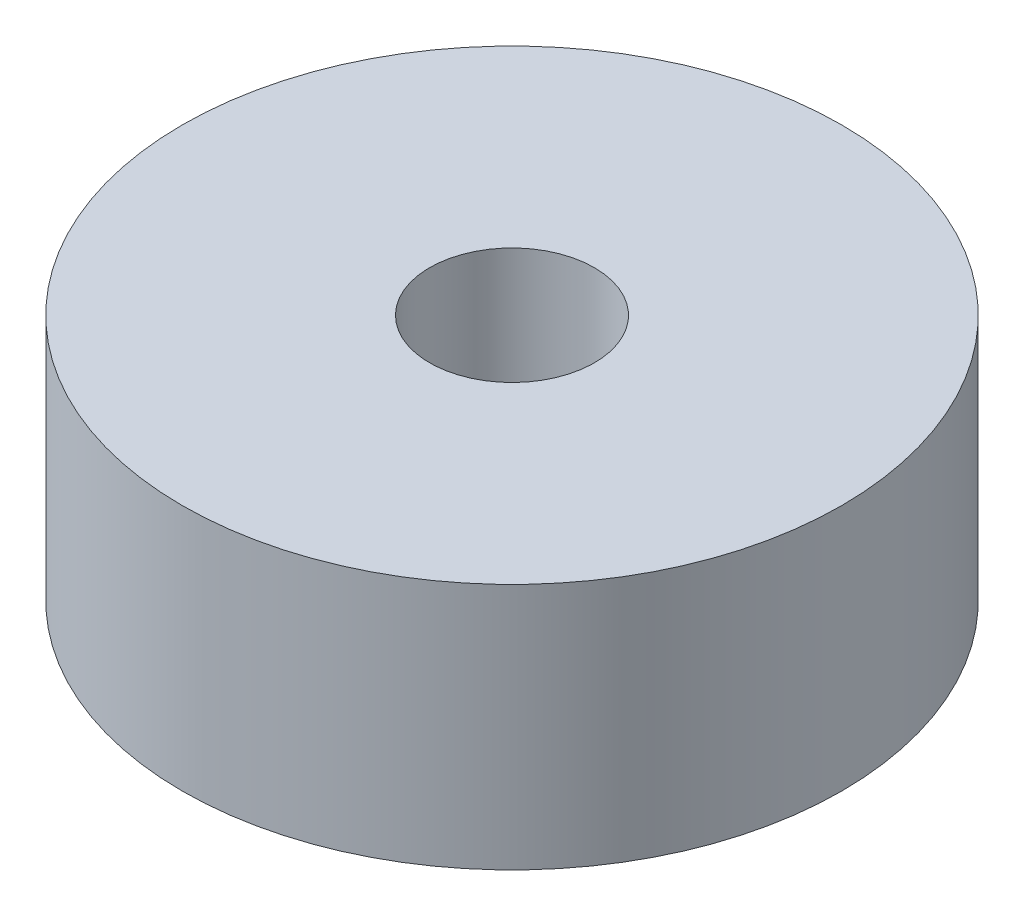
ISO-10303-21;
HEADER;
FILE_DESCRIPTION(('STEP AP214'),'2;1');
FILE_NAME('part.step','',(''),(''),'','','');
FILE_SCHEMA(('AUTOMOTIVE_DESIGN { 1 0 10303 214 1 1 1 1 }'));
ENDSEC;
DATA;
#1=APPLICATION_CONTEXT('core data for automotive mechanical design processes');
#2=APPLICATION_PROTOCOL_DEFINITION('international standard','automotive_design',2000,#1);
#3=PRODUCT_CONTEXT('',#1,'mechanical');
#4=PRODUCT('Part','Part','',(#3));
#5=PRODUCT_RELATED_PRODUCT_CATEGORY('part','',(#4));
#6=PRODUCT_DEFINITION_FORMATION('','',#4);
#7=PRODUCT_DEFINITION_CONTEXT('part definition',#1,'design');
#8=PRODUCT_DEFINITION('design','',#6,#7);
#9=PRODUCT_DEFINITION_SHAPE('','',#8);
#10=(LENGTH_UNIT() NAMED_UNIT(*) SI_UNIT(.MILLI.,.METRE.));
#11=(NAMED_UNIT(*) PLANE_ANGLE_UNIT() SI_UNIT($,.RADIAN.));
#12=(NAMED_UNIT(*) SI_UNIT($,.STERADIAN.) SOLID_ANGLE_UNIT());
#13=UNCERTAINTY_MEASURE_WITH_UNIT(LENGTH_MEASURE(1.E-05),#10,'distance_accuracy_value','');
#14=(GEOMETRIC_REPRESENTATION_CONTEXT(3) GLOBAL_UNCERTAINTY_ASSIGNED_CONTEXT((#13)) GLOBAL_UNIT_ASSIGNED_CONTEXT((#10,
#11,#12)) REPRESENTATION_CONTEXT('',''));
#15=CARTESIAN_POINT('',(0.,0.,0.));
#16=DIRECTION('',(0.,0.,1.));
#17=DIRECTION('',(1.,0.,0.));
#18=AXIS2_PLACEMENT_3D('',#15,#16,#17);
#19=CARTESIAN_POINT('',(0.,0.,0.));
#20=DIRECTION('',(0.,-1.,0.));
#21=DIRECTION('',(0.,0.,-1.));
#22=AXIS2_PLACEMENT_3D('',#19,#20,#21);
#23=CYLINDRICAL_SURFACE('',#22,4.);
#24=CARTESIAN_POINT('',(0.,-1.,0.));
#25=DIRECTION('',(0.,-1.,0.));
#26=DIRECTION('',(0.,0.,-1.));
#27=AXIS2_PLACEMENT_3D('',#24,#25,#26);
#28=CIRCLE('',#27,4.);
#29=CARTESIAN_POINT('',(0.,-1.,-4.));
#30=VERTEX_POINT('',#29);
#31=EDGE_CURVE('E10',#30,#30,#28,.T.);
#32=ORIENTED_EDGE('',*,*,#31,.T.);
#33=EDGE_LOOP('',(#32));
#34=FACE_BOUND('',#33,.T.);
#35=CARTESIAN_POINT('',(0.,11.,0.));
#36=DIRECTION('',(0.,-1.,0.));
#37=DIRECTION('',(0.,0.,-1.));
#38=AXIS2_PLACEMENT_3D('',#35,#36,#37);
#39=CIRCLE('',#38,4.);
#40=CARTESIAN_POINT('',(0.,11.,-4.));
#41=VERTEX_POINT('',#40);
#42=EDGE_CURVE('E54',#41,#41,#39,.T.);
#43=ORIENTED_EDGE('',*,*,#42,.F.);
#44=EDGE_LOOP('',(#43));
#45=FACE_BOUND('',#44,.T.);
#46=ADVANCED_FACE('F41',(#34,#45),#23,.F.);
#47=CARTESIAN_POINT('',(0.,-1.,0.));
#48=DIRECTION('',(0.,-1.,0.));
#49=DIRECTION('',(0.,0.,-1.));
#50=AXIS2_PLACEMENT_3D('',#47,#48,#49);
#51=PLANE('',#50);
#52=CARTESIAN_POINT('',(0.,-1.,0.));
#53=DIRECTION('',(0.,-1.,0.));
#54=DIRECTION('',(0.,0.,-1.));
#55=AXIS2_PLACEMENT_3D('',#52,#53,#54);
#56=CIRCLE('',#55,16.);
#57=CARTESIAN_POINT('',(0.,-1.,-16.));
#58=VERTEX_POINT('',#57);
#59=EDGE_CURVE('E50',#58,#58,#56,.T.);
#60=ORIENTED_EDGE('',*,*,#59,.T.);
#61=EDGE_LOOP('',(#60));
#62=FACE_BOUND('',#61,.T.);
#63=ORIENTED_EDGE('',*,*,#31,.F.);
#64=EDGE_LOOP('',(#63));
#65=FACE_BOUND('',#64,.T.);
#66=ADVANCED_FACE('F106',(#62,#65),#51,.T.);
#67=CARTESIAN_POINT('',(0.,0.,0.));
#68=DIRECTION('',(0.,-1.,0.));
#69=DIRECTION('',(0.,0.,-1.));
#70=AXIS2_PLACEMENT_3D('',#67,#68,#69);
#71=CYLINDRICAL_SURFACE('',#70,16.);
#72=CARTESIAN_POINT('',(0.,11.,0.));
#73=DIRECTION('',(0.,-1.,0.));
#74=DIRECTION('',(0.,0.,-1.));
#75=AXIS2_PLACEMENT_3D('',#72,#73,#74);
#76=CIRCLE('',#75,16.);
#77=CARTESIAN_POINT('',(0.,11.,-16.));
#78=VERTEX_POINT('',#77);
#79=EDGE_CURVE('E51',#78,#78,#76,.T.);
#80=ORIENTED_EDGE('',*,*,#79,.T.);
#81=EDGE_LOOP('',(#80));
#82=FACE_BOUND('',#81,.T.);
#83=ORIENTED_EDGE('',*,*,#59,.F.);
#84=EDGE_LOOP('',(#83));
#85=FACE_BOUND('',#84,.T.);
#86=ADVANCED_FACE('F103',(#82,#85),#71,.T.);
#87=CARTESIAN_POINT('',(0.,11.,0.));
#88=DIRECTION('',(0.,1.,0.));
#89=DIRECTION('',(0.,0.,1.));
#90=AXIS2_PLACEMENT_3D('',#87,#88,#89);
#91=PLANE('',#90);
#92=ORIENTED_EDGE('',*,*,#42,.T.);
#93=EDGE_LOOP('',(#92));
#94=FACE_BOUND('',#93,.T.);
#95=ORIENTED_EDGE('',*,*,#79,.F.);
#96=EDGE_LOOP('',(#95));
#97=FACE_BOUND('',#96,.T.);
#98=ADVANCED_FACE('F101',(#94,#97),#91,.T.);
#99=CLOSED_SHELL('',(#46,#66,#86,#98));
#100=CARTESIAN_POINT('',(0.,0.,0.));
#101=DIRECTION('',(0.,-1.,0.));
#102=DIRECTION('',(0.,0.,-1.));
#103=AXIS2_PLACEMENT_3D('',#100,#101,#102);
#104=CYLINDRICAL_SURFACE('',#103,5.);
#105=CARTESIAN_POINT('',(0.,0.,0.));
#106=DIRECTION('',(0.,-1.,0.));
#107=DIRECTION('',(0.,0.,-1.));
#108=AXIS2_PLACEMENT_3D('',#105,#106,#107);
#109=CIRCLE('',#108,5.);
#110=CARTESIAN_POINT('',(0.,0.,-5.));
#111=VERTEX_POINT('',#110);
#112=EDGE_CURVE('E58',#111,#111,#109,.T.);
#113=ORIENTED_EDGE('',*,*,#112,.F.);
#114=EDGE_LOOP('',(#113));
#115=FACE_BOUND('',#114,.T.);
#116=CARTESIAN_POINT('',(0.,10.,0.));
#117=DIRECTION('',(0.,-1.,0.));
#118=DIRECTION('',(0.,0.,-1.));
#119=AXIS2_PLACEMENT_3D('',#116,#117,#118);
#120=CIRCLE('',#119,5.);
#121=CARTESIAN_POINT('',(0.,10.,-5.));
#122=VERTEX_POINT('',#121);
#123=EDGE_CURVE('E67',#122,#122,#120,.T.);
#124=ORIENTED_EDGE('',*,*,#123,.T.);
#125=EDGE_LOOP('',(#124));
#126=FACE_BOUND('',#125,.T.);
#127=ADVANCED_FACE('F71',(#115,#126),#104,.T.);
#128=CARTESIAN_POINT('',(5.,0.,0.));
#129=DIRECTION('',(0.,-1.,0.));
#130=DIRECTION('',(0.,0.,-1.));
#131=AXIS2_PLACEMENT_3D('',#128,#129,#130);
#132=PLANE('',#131);
#133=CARTESIAN_POINT('',(0.,0.,0.));
#134=DIRECTION('',(0.,-1.,0.));
#135=DIRECTION('',(0.,0.,-1.));
#136=AXIS2_PLACEMENT_3D('',#133,#134,#135);
#137=CIRCLE('',#136,15.);
#138=CARTESIAN_POINT('',(0.,0.,-15.));
#139=VERTEX_POINT('',#138);
#140=EDGE_CURVE('E62',#139,#139,#137,.T.);
#141=ORIENTED_EDGE('',*,*,#140,.F.);
#142=EDGE_LOOP('',(#141));
#143=FACE_BOUND('',#142,.T.);
#144=ORIENTED_EDGE('',*,*,#112,.T.);
#145=EDGE_LOOP('',(#144));
#146=FACE_BOUND('',#145,.T.);
#147=ADVANCED_FACE('F81',(#143,#146),#132,.F.);
#148=CARTESIAN_POINT('',(0.,0.,0.));
#149=DIRECTION('',(0.,-1.,0.));
#150=DIRECTION('',(0.,0.,-1.));
#151=AXIS2_PLACEMENT_3D('',#148,#149,#150);
#152=CYLINDRICAL_SURFACE('',#151,15.);
#153=CARTESIAN_POINT('',(0.,10.,0.));
#154=DIRECTION('',(0.,-1.,0.));
#155=DIRECTION('',(0.,0.,-1.));
#156=AXIS2_PLACEMENT_3D('',#153,#154,#155);
#157=CIRCLE('',#156,15.);
#158=CARTESIAN_POINT('',(0.,10.,-15.));
#159=VERTEX_POINT('',#158);
#160=EDGE_CURVE('E66',#159,#159,#157,.T.);
#161=ORIENTED_EDGE('',*,*,#160,.F.);
#162=EDGE_LOOP('',(#161));
#163=FACE_BOUND('',#162,.T.);
#164=ORIENTED_EDGE('',*,*,#140,.T.);
#165=EDGE_LOOP('',(#164));
#166=FACE_BOUND('',#165,.T.);
#167=ADVANCED_FACE('F77',(#163,#166),#152,.F.);
#168=CARTESIAN_POINT('',(5.,10.,0.));
#169=DIRECTION('',(0.,1.,0.));
#170=DIRECTION('',(0.,0.,1.));
#171=AXIS2_PLACEMENT_3D('',#168,#169,#170);
#172=PLANE('',#171);
#173=ORIENTED_EDGE('',*,*,#123,.F.);
#174=EDGE_LOOP('',(#173));
#175=FACE_BOUND('',#174,.T.);
#176=ORIENTED_EDGE('',*,*,#160,.T.);
#177=EDGE_LOOP('',(#176));
#178=FACE_BOUND('',#177,.T.);
#179=ADVANCED_FACE('F73',(#175,#178),#172,.F.);
#180=CLOSED_SHELL('',(#127,#147,#167,#179));
#181=ORIENTED_CLOSED_SHELL('',*,#180,.T.);
#182=BREP_WITH_VOIDS('B2',#99,(#181));
#183=ADVANCED_BREP_SHAPE_REPRESENTATION('',(#18,#182),#14);
#184=SHAPE_DEFINITION_REPRESENTATION(#9,#183);
ENDSEC;
END-ISO-10303-21;
